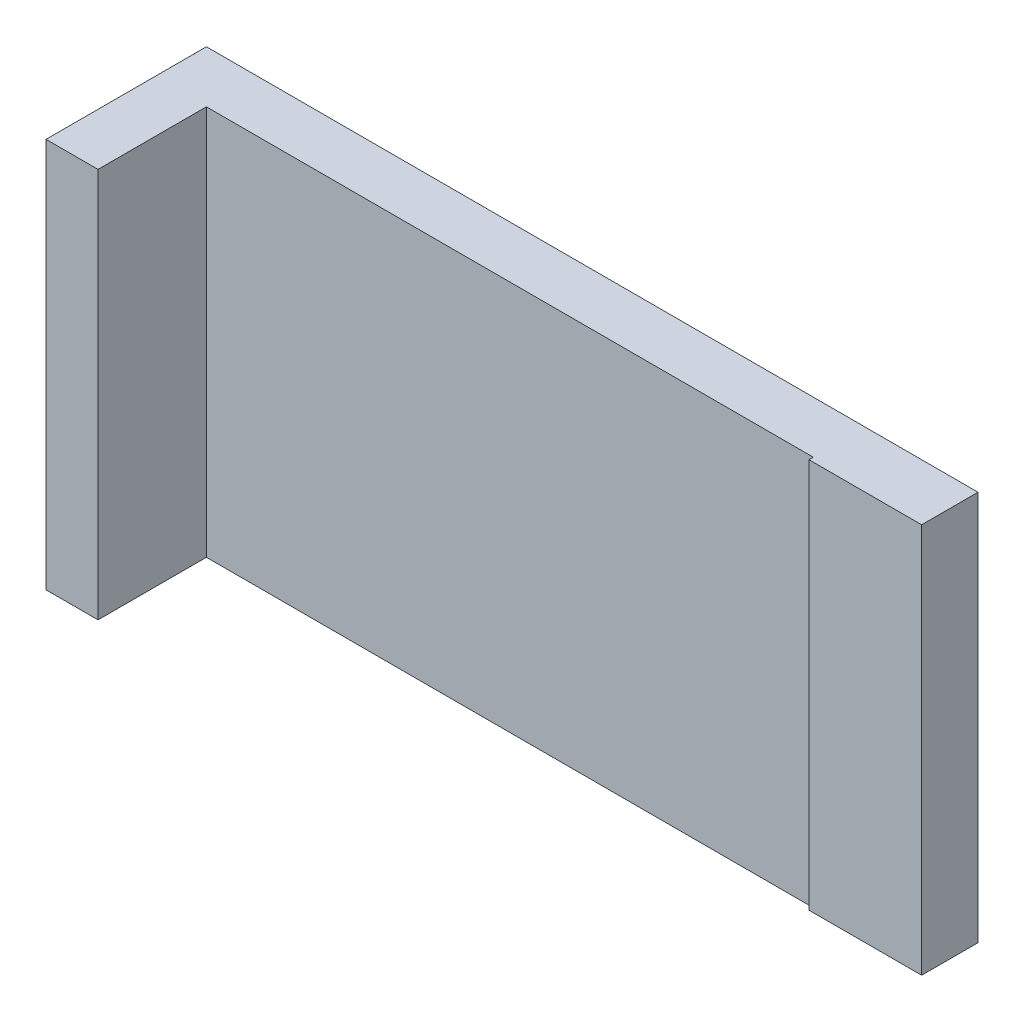
ISO-10303-21;
HEADER;
FILE_DESCRIPTION(('STEP AP214'),'2;1');
FILE_NAME('part.step','',(''),(''),'','','');
FILE_SCHEMA(('AUTOMOTIVE_DESIGN { 1 0 10303 214 1 1 1 1 }'));
ENDSEC;
DATA;
#1=APPLICATION_CONTEXT('core data for automotive mechanical design processes');
#2=APPLICATION_PROTOCOL_DEFINITION('international standard','automotive_design',2000,#1);
#3=PRODUCT_CONTEXT('',#1,'mechanical');
#4=PRODUCT('Part','Part','',(#3));
#5=PRODUCT_RELATED_PRODUCT_CATEGORY('part','',(#4));
#6=PRODUCT_DEFINITION_FORMATION('','',#4);
#7=PRODUCT_DEFINITION_CONTEXT('part definition',#1,'design');
#8=PRODUCT_DEFINITION('design','',#6,#7);
#9=PRODUCT_DEFINITION_SHAPE('','',#8);
#10=(LENGTH_UNIT() NAMED_UNIT(*) SI_UNIT(.MILLI.,.METRE.));
#11=(NAMED_UNIT(*) PLANE_ANGLE_UNIT() SI_UNIT($,.RADIAN.));
#12=(NAMED_UNIT(*) SI_UNIT($,.STERADIAN.) SOLID_ANGLE_UNIT());
#13=UNCERTAINTY_MEASURE_WITH_UNIT(LENGTH_MEASURE(1.E-05),#10,'distance_accuracy_value','');
#14=(GEOMETRIC_REPRESENTATION_CONTEXT(3) GLOBAL_UNCERTAINTY_ASSIGNED_CONTEXT((#13)) GLOBAL_UNIT_ASSIGNED_CONTEXT((#10,
#11,#12)) REPRESENTATION_CONTEXT('',''));
#15=CARTESIAN_POINT('',(0.,0.,0.));
#16=DIRECTION('',(0.,0.,1.));
#17=DIRECTION('',(1.,0.,0.));
#18=AXIS2_PLACEMENT_3D('',#15,#16,#17);
#19=CARTESIAN_POINT('',(0.,0.,0.));
#20=DIRECTION('',(0.,0.,-1.));
#21=DIRECTION('',(-1.,0.,0.));
#22=AXIS2_PLACEMENT_3D('',#19,#20,#21);
#23=PLANE('',#22);
#24=DIRECTION('',(0.,-1.,0.));
#25=VECTOR('',#24,1.);
#26=CARTESIAN_POINT('',(18.75,0.,0.));
#27=LINE('',#26,#25);
#28=CARTESIAN_POINT('',(18.75,11.25,0.));
#29=VERTEX_POINT('',#28);
#30=CARTESIAN_POINT('',(18.75,-11.25,0.));
#31=VERTEX_POINT('',#30);
#32=EDGE_CURVE('E12',#29,#31,#27,.T.);
#33=ORIENTED_EDGE('',*,*,#32,.F.);
#34=DIRECTION('',(-1.,0.,0.));
#35=VECTOR('',#34,1.);
#36=CARTESIAN_POINT('',(-16.25,11.25,0.));
#37=LINE('',#36,#35);
#38=CARTESIAN_POINT('',(-16.25,11.25,0.));
#39=VERTEX_POINT('',#38);
#40=EDGE_CURVE('E153',#29,#39,#37,.T.);
#41=ORIENTED_EDGE('',*,*,#40,.T.);
#42=DIRECTION('',(0.,-1.,0.));
#43=VECTOR('',#42,1.);
#44=CARTESIAN_POINT('',(-16.25,-11.25,0.));
#45=LINE('',#44,#43);
#46=CARTESIAN_POINT('',(-16.25,-11.25,0.));
#47=VERTEX_POINT('',#46);
#48=EDGE_CURVE('E149',#39,#47,#45,.T.);
#49=ORIENTED_EDGE('',*,*,#48,.T.);
#50=DIRECTION('',(1.,0.,0.));
#51=VECTOR('',#50,1.);
#52=CARTESIAN_POINT('',(-16.25,-11.25,0.));
#53=LINE('',#52,#51);
#54=EDGE_CURVE('E55',#47,#31,#53,.T.);
#55=ORIENTED_EDGE('',*,*,#54,.T.);
#56=EDGE_LOOP('',(#33,#41,#49,#55));
#57=FACE_BOUND('',#56,.T.);
#58=ADVANCED_FACE('F37',(#57),#23,.F.);
#59=CARTESIAN_POINT('',(-16.25,11.25,-3.));
#60=DIRECTION('',(0.,1.,0.));
#61=DIRECTION('',(0.,0.,1.));
#62=AXIS2_PLACEMENT_3D('',#59,#60,#61);
#63=PLANE('',#62);
#64=DIRECTION('',(-1.,0.,0.));
#65=VECTOR('',#64,1.);
#66=CARTESIAN_POINT('',(-16.25,11.25,-3.));
#67=LINE('',#66,#65);
#68=CARTESIAN_POINT('',(25.25,11.25,-3.));
#69=VERTEX_POINT('',#68);
#70=CARTESIAN_POINT('',(-19.25,11.25,-3.));
#71=VERTEX_POINT('',#70);
#72=EDGE_CURVE('E156',#69,#71,#67,.T.);
#73=ORIENTED_EDGE('',*,*,#72,.T.);
#74=DIRECTION('',(0.,0.,-1.));
#75=VECTOR('',#74,1.);
#76=CARTESIAN_POINT('',(-19.25,11.25,-3.));
#77=LINE('',#76,#75);
#78=CARTESIAN_POINT('',(-19.25,11.25,6.25000000000003));
#79=VERTEX_POINT('',#78);
#80=EDGE_CURVE('E137',#79,#71,#77,.T.);
#81=ORIENTED_EDGE('',*,*,#80,.F.);
#82=DIRECTION('',(1.,0.,0.));
#83=VECTOR('',#82,1.);
#84=CARTESIAN_POINT('',(-19.25,11.25,6.25000000000003));
#85=LINE('',#84,#83);
#86=CARTESIAN_POINT('',(-16.25,11.25,6.25000000000003));
#87=VERTEX_POINT('',#86);
#88=EDGE_CURVE('E139',#79,#87,#85,.T.);
#89=ORIENTED_EDGE('',*,*,#88,.T.);
#90=DIRECTION('',(0.,0.,-1.));
#91=VECTOR('',#90,1.);
#92=CARTESIAN_POINT('',(-16.25,11.25,-3.));
#93=LINE('',#92,#91);
#94=EDGE_CURVE('E133',#87,#39,#93,.T.);
#95=ORIENTED_EDGE('',*,*,#94,.T.);
#96=ORIENTED_EDGE('',*,*,#40,.F.);
#97=DIRECTION('',(0.,0.,-1.));
#98=VECTOR('',#97,1.);
#99=CARTESIAN_POINT('',(18.75,11.25,23.9200768572607));
#100=LINE('',#99,#98);
#101=CARTESIAN_POINT('',(18.75,11.25,0.250000000000007));
#102=VERTEX_POINT('',#101);
#103=EDGE_CURVE('E107',#102,#29,#100,.T.);
#104=ORIENTED_EDGE('',*,*,#103,.F.);
#105=DIRECTION('',(-1.,0.,0.));
#106=VECTOR('',#105,1.);
#107=CARTESIAN_POINT('',(25.2499999999999,11.25,0.25));
#108=LINE('',#107,#106);
#109=CARTESIAN_POINT('',(25.25,11.25,0.250000000000007));
#110=VERTEX_POINT('',#109);
#111=EDGE_CURVE('E120',#110,#102,#108,.T.);
#112=ORIENTED_EDGE('',*,*,#111,.F.);
#113=DIRECTION('',(0.,0.,1.));
#114=VECTOR('',#113,1.);
#115=CARTESIAN_POINT('',(25.25,11.25,-3.));
#116=LINE('',#115,#114);
#117=EDGE_CURVE('E45',#69,#110,#116,.T.);
#118=ORIENTED_EDGE('',*,*,#117,.F.);
#119=EDGE_LOOP('',(#73,#81,#89,#95,#96,#104,#112,#118));
#120=FACE_BOUND('',#119,.T.);
#121=ADVANCED_FACE('F166',(#120),#63,.T.);
#122=CARTESIAN_POINT('',(25.25,-11.25,-3.));
#123=DIRECTION('',(1.,0.,0.));
#124=DIRECTION('',(0.,0.,-1.));
#125=AXIS2_PLACEMENT_3D('',#122,#123,#124);
#126=PLANE('',#125);
#127=ORIENTED_EDGE('',*,*,#117,.T.);
#128=DIRECTION('',(0.,1.,0.));
#129=VECTOR('',#128,1.);
#130=CARTESIAN_POINT('',(25.25,-11.25,0.25));
#131=LINE('',#130,#129);
#132=CARTESIAN_POINT('',(25.25,-11.25,0.25));
#133=VERTEX_POINT('',#132);
#134=EDGE_CURVE('E115',#133,#110,#131,.T.);
#135=ORIENTED_EDGE('',*,*,#134,.F.);
#136=DIRECTION('',(0.,0.,1.));
#137=VECTOR('',#136,1.);
#138=CARTESIAN_POINT('',(25.25,-11.25,-3.));
#139=LINE('',#138,#137);
#140=CARTESIAN_POINT('',(25.25,-11.25,-3.));
#141=VERTEX_POINT('',#140);
#142=EDGE_CURVE('E111',#141,#133,#139,.T.);
#143=ORIENTED_EDGE('',*,*,#142,.F.);
#144=DIRECTION('',(0.,1.,0.));
#145=VECTOR('',#144,1.);
#146=CARTESIAN_POINT('',(25.25,-11.25,-3.));
#147=LINE('',#146,#145);
#148=EDGE_CURVE('E152',#141,#69,#147,.T.);
#149=ORIENTED_EDGE('',*,*,#148,.T.);
#150=EDGE_LOOP('',(#127,#135,#143,#149));
#151=FACE_BOUND('',#150,.T.);
#152=ADVANCED_FACE('F162',(#151),#126,.T.);
#153=CARTESIAN_POINT('',(-16.25,-11.25,-3.));
#154=DIRECTION('',(0.,-1.,0.));
#155=DIRECTION('',(0.,0.,-1.));
#156=AXIS2_PLACEMENT_3D('',#153,#154,#155);
#157=PLANE('',#156);
#158=DIRECTION('',(0.,0.,-1.));
#159=VECTOR('',#158,1.);
#160=CARTESIAN_POINT('',(18.75,-11.25,23.9200768572607));
#161=LINE('',#160,#159);
#162=CARTESIAN_POINT('',(18.75,-11.25,0.250000000000007));
#163=VERTEX_POINT('',#162);
#164=EDGE_CURVE('E98',#163,#31,#161,.T.);
#165=ORIENTED_EDGE('',*,*,#164,.T.);
#166=ORIENTED_EDGE('',*,*,#54,.F.);
#167=DIRECTION('',(0.,0.,1.));
#168=VECTOR('',#167,1.);
#169=CARTESIAN_POINT('',(-16.25,-11.25,-3.));
#170=LINE('',#169,#168);
#171=CARTESIAN_POINT('',(-16.25,-11.25,6.25000000000003));
#172=VERTEX_POINT('',#171);
#173=EDGE_CURVE('E121',#47,#172,#170,.T.);
#174=ORIENTED_EDGE('',*,*,#173,.T.);
#175=DIRECTION('',(1.,0.,0.));
#176=VECTOR('',#175,1.);
#177=CARTESIAN_POINT('',(-19.25,-11.25,6.25000000000003));
#178=LINE('',#177,#176);
#179=CARTESIAN_POINT('',(-19.25,-11.25,6.25000000000003));
#180=VERTEX_POINT('',#179);
#181=EDGE_CURVE('E146',#180,#172,#178,.T.);
#182=ORIENTED_EDGE('',*,*,#181,.F.);
#183=DIRECTION('',(0.,0.,1.));
#184=VECTOR('',#183,1.);
#185=CARTESIAN_POINT('',(-19.25,-11.25,-3.));
#186=LINE('',#185,#184);
#187=CARTESIAN_POINT('',(-19.25,-11.25,-3.));
#188=VERTEX_POINT('',#187);
#189=EDGE_CURVE('E132',#188,#180,#186,.T.);
#190=ORIENTED_EDGE('',*,*,#189,.F.);
#191=DIRECTION('',(1.,0.,0.));
#192=VECTOR('',#191,1.);
#193=CARTESIAN_POINT('',(-16.25,-11.25,-3.));
#194=LINE('',#193,#192);
#195=EDGE_CURVE('E150',#188,#141,#194,.T.);
#196=ORIENTED_EDGE('',*,*,#195,.T.);
#197=ORIENTED_EDGE('',*,*,#142,.T.);
#198=DIRECTION('',(1.,0.,0.));
#199=VECTOR('',#198,1.);
#200=CARTESIAN_POINT('',(25.25,-11.25,0.25));
#201=LINE('',#200,#199);
#202=EDGE_CURVE('E106',#163,#133,#201,.T.);
#203=ORIENTED_EDGE('',*,*,#202,.F.);
#204=EDGE_LOOP('',(#165,#166,#174,#182,#190,#196,#197,#203));
#205=FACE_BOUND('',#204,.T.);
#206=ADVANCED_FACE('F39',(#205),#157,.T.);
#207=CARTESIAN_POINT('',(0.,0.,-3.));
#208=DIRECTION('',(0.,0.,-1.));
#209=DIRECTION('',(-1.,0.,0.));
#210=AXIS2_PLACEMENT_3D('',#207,#208,#209);
#211=PLANE('',#210);
#212=ORIENTED_EDGE('',*,*,#148,.F.);
#213=ORIENTED_EDGE('',*,*,#195,.F.);
#214=DIRECTION('',(0.,-1.,0.));
#215=VECTOR('',#214,1.);
#216=CARTESIAN_POINT('',(-19.25,-11.25,-3.));
#217=LINE('',#216,#215);
#218=EDGE_CURVE('E129',#71,#188,#217,.T.);
#219=ORIENTED_EDGE('',*,*,#218,.F.);
#220=ORIENTED_EDGE('',*,*,#72,.F.);
#221=EDGE_LOOP('',(#212,#213,#219,#220));
#222=FACE_BOUND('',#221,.T.);
#223=ADVANCED_FACE('F183',(#222),#211,.T.);
#224=CARTESIAN_POINT('',(-16.25,0.,0.));
#225=DIRECTION('',(1.,0.,0.));
#226=DIRECTION('',(0.,0.,-1.));
#227=AXIS2_PLACEMENT_3D('',#224,#225,#226);
#228=PLANE('',#227);
#229=ORIENTED_EDGE('',*,*,#48,.F.);
#230=ORIENTED_EDGE('',*,*,#94,.F.);
#231=DIRECTION('',(0.,1.,0.));
#232=VECTOR('',#231,1.);
#233=CARTESIAN_POINT('',(-16.25,-11.25,6.25000000000003));
#234=LINE('',#233,#232);
#235=EDGE_CURVE('E123',#172,#87,#234,.T.);
#236=ORIENTED_EDGE('',*,*,#235,.F.);
#237=ORIENTED_EDGE('',*,*,#173,.F.);
#238=EDGE_LOOP('',(#229,#230,#236,#237));
#239=FACE_BOUND('',#238,.T.);
#240=ADVANCED_FACE('F170',(#239),#228,.T.);
#241=CARTESIAN_POINT('',(-19.25,-11.25,6.25000000000003));
#242=DIRECTION('',(0.,0.,-1.));
#243=DIRECTION('',(-1.,0.,0.));
#244=AXIS2_PLACEMENT_3D('',#241,#242,#243);
#245=PLANE('',#244);
#246=ORIENTED_EDGE('',*,*,#235,.T.);
#247=ORIENTED_EDGE('',*,*,#88,.F.);
#248=DIRECTION('',(0.,1.,0.));
#249=VECTOR('',#248,1.);
#250=CARTESIAN_POINT('',(-19.25,-11.25,6.25000000000003));
#251=LINE('',#250,#249);
#252=EDGE_CURVE('E135',#180,#79,#251,.T.);
#253=ORIENTED_EDGE('',*,*,#252,.F.);
#254=ORIENTED_EDGE('',*,*,#181,.T.);
#255=EDGE_LOOP('',(#246,#247,#253,#254));
#256=FACE_BOUND('',#255,.T.);
#257=ADVANCED_FACE('F176',(#256),#245,.F.);
#258=CARTESIAN_POINT('',(-19.25,0.,0.));
#259=DIRECTION('',(1.,0.,0.));
#260=DIRECTION('',(0.,0.,-1.));
#261=AXIS2_PLACEMENT_3D('',#258,#259,#260);
#262=PLANE('',#261);
#263=ORIENTED_EDGE('',*,*,#218,.T.);
#264=ORIENTED_EDGE('',*,*,#189,.T.);
#265=ORIENTED_EDGE('',*,*,#252,.T.);
#266=ORIENTED_EDGE('',*,*,#80,.T.);
#267=EDGE_LOOP('',(#263,#264,#265,#266));
#268=FACE_BOUND('',#267,.T.);
#269=ADVANCED_FACE('F180',(#268),#262,.F.);
#270=CARTESIAN_POINT('',(18.75,-11.25,23.9200768572607));
#271=DIRECTION('',(1.,0.,0.));
#272=DIRECTION('',(0.,1.,0.));
#273=AXIS2_PLACEMENT_3D('',#270,#271,#272);
#274=PLANE('',#273);
#275=ORIENTED_EDGE('',*,*,#103,.T.);
#276=ORIENTED_EDGE('',*,*,#32,.T.);
#277=ORIENTED_EDGE('',*,*,#164,.F.);
#278=DIRECTION('',(0.,-1.,0.));
#279=VECTOR('',#278,1.);
#280=CARTESIAN_POINT('',(18.75,-11.25,0.25));
#281=LINE('',#280,#279);
#282=EDGE_CURVE('E103',#102,#163,#281,.T.);
#283=ORIENTED_EDGE('',*,*,#282,.F.);
#284=EDGE_LOOP('',(#275,#276,#277,#283));
#285=FACE_BOUND('',#284,.T.);
#286=ADVANCED_FACE('F101',(#285),#274,.F.);
#287=CARTESIAN_POINT('',(35.5,22.75,0.25));
#288=DIRECTION('',(0.,0.,1.));
#289=DIRECTION('',(0.,1.,0.));
#290=AXIS2_PLACEMENT_3D('',#287,#288,#289);
#291=PLANE('',#290);
#292=ORIENTED_EDGE('',*,*,#202,.T.);
#293=ORIENTED_EDGE('',*,*,#134,.T.);
#294=ORIENTED_EDGE('',*,*,#111,.T.);
#295=ORIENTED_EDGE('',*,*,#282,.T.);
#296=EDGE_LOOP('',(#292,#293,#294,#295));
#297=FACE_BOUND('',#296,.T.);
#298=ADVANCED_FACE('F118',(#297),#291,.T.);
#299=CLOSED_SHELL('',(#58,#121,#152,#206,#223,#240,#257,#269,#286,#298));
#300=MANIFOLD_SOLID_BREP('B2',#299);
#301=ADVANCED_BREP_SHAPE_REPRESENTATION('',(#18,#300),#14);
#302=SHAPE_DEFINITION_REPRESENTATION(#9,#301);
ENDSEC;
END-ISO-10303-21;
